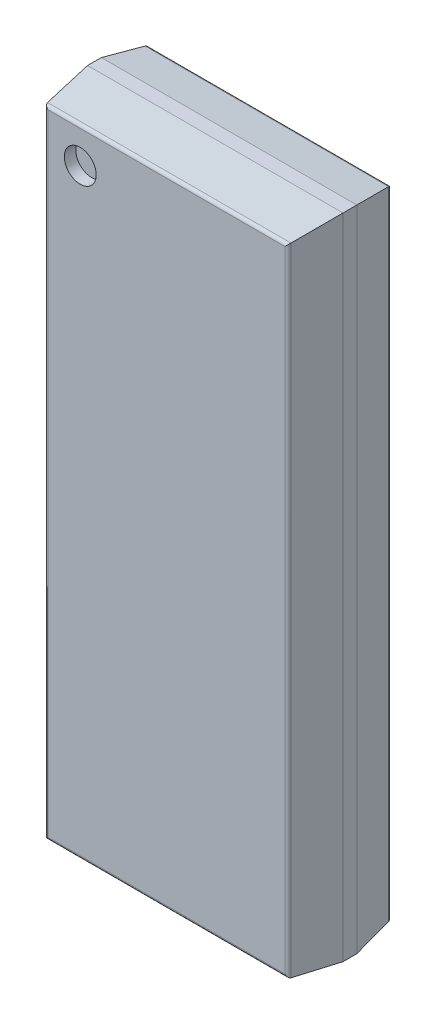
ISO-10303-21;
HEADER;
FILE_DESCRIPTION(('STEP AP214'),'2;1');
FILE_NAME('part.step','',(''),(''),'','','');
FILE_SCHEMA(('AUTOMOTIVE_DESIGN { 1 0 10303 214 1 1 1 1 }'));
ENDSEC;
DATA;
#1=APPLICATION_CONTEXT('core data for automotive mechanical design processes');
#2=APPLICATION_PROTOCOL_DEFINITION('international standard','automotive_design',2000,#1);
#3=PRODUCT_CONTEXT('',#1,'mechanical');
#4=PRODUCT('Part','Part','',(#3));
#5=PRODUCT_RELATED_PRODUCT_CATEGORY('part','',(#4));
#6=PRODUCT_DEFINITION_FORMATION('','',#4);
#7=PRODUCT_DEFINITION_CONTEXT('part definition',#1,'design');
#8=PRODUCT_DEFINITION('design','',#6,#7);
#9=PRODUCT_DEFINITION_SHAPE('','',#8);
#10=(LENGTH_UNIT() NAMED_UNIT(*) SI_UNIT(.MILLI.,.METRE.));
#11=(NAMED_UNIT(*) PLANE_ANGLE_UNIT() SI_UNIT($,.RADIAN.));
#12=(NAMED_UNIT(*) SI_UNIT($,.STERADIAN.) SOLID_ANGLE_UNIT());
#13=UNCERTAINTY_MEASURE_WITH_UNIT(LENGTH_MEASURE(1.E-05),#10,'distance_accuracy_value','');
#14=(GEOMETRIC_REPRESENTATION_CONTEXT(3) GLOBAL_UNCERTAINTY_ASSIGNED_CONTEXT((#13)) GLOBAL_UNIT_ASSIGNED_CONTEXT((#10,
#11,#12)) REPRESENTATION_CONTEXT('',''));
#15=CARTESIAN_POINT('',(0.,0.,0.));
#16=DIRECTION('',(0.,0.,1.));
#17=DIRECTION('',(1.,0.,0.));
#18=AXIS2_PLACEMENT_3D('',#15,#16,#17);
#19=CARTESIAN_POINT('',(-1.315,4.315,1.575));
#20=DIRECTION('',(0.,0.,1.));
#21=DIRECTION('',(1.,0.,0.));
#22=AXIS2_PLACEMENT_3D('',#19,#20,#21);
#23=PLANE('',#22);
#24=CARTESIAN_POINT('',(-1.315,4.315,1.575));
#25=DIRECTION('',(0.,0.,1.));
#26=DIRECTION('',(1.,0.,0.));
#27=AXIS2_PLACEMENT_3D('',#24,#25,#26);
#28=CIRCLE('',#27,0.24375);
#29=CARTESIAN_POINT('',(-1.07125,4.315,1.575));
#30=VERTEX_POINT('',#29);
#31=EDGE_CURVE('E20',#30,#30,#28,.T.);
#32=ORIENTED_EDGE('',*,*,#31,.T.);
#33=EDGE_LOOP('',(#32));
#34=FACE_BOUND('',#33,.T.);
#35=ADVANCED_FACE('F17',(#34),#23,.T.);
#36=CARTESIAN_POINT('',(-1.315,4.315,1.575));
#37=DIRECTION('',(0.,0.,1.));
#38=DIRECTION('',(1.,0.,0.));
#39=AXIS2_PLACEMENT_3D('',#36,#37,#38);
#40=CYLINDRICAL_SURFACE('',#39,0.24375);
#41=CARTESIAN_POINT('',(-1.315,4.315,1.75));
#42=DIRECTION('',(0.,0.,1.));
#43=DIRECTION('',(1.,0.,0.));
#44=AXIS2_PLACEMENT_3D('',#41,#42,#43);
#45=CIRCLE('',#44,0.24375);
#46=CARTESIAN_POINT('',(-1.07125,4.315,1.75));
#47=VERTEX_POINT('',#46);
#48=EDGE_CURVE('E100',#47,#47,#45,.F.);
#49=ORIENTED_EDGE('',*,*,#48,.F.);
#50=EDGE_LOOP('',(#49));
#51=FACE_BOUND('',#50,.T.);
#52=ORIENTED_EDGE('',*,*,#31,.F.);
#53=EDGE_LOOP('',(#52));
#54=FACE_BOUND('',#53,.T.);
#55=ADVANCED_FACE('F117',(#51,#54),#40,.F.);
#56=CARTESIAN_POINT('',(-1.95,-4.95,1.75));
#57=DIRECTION('',(0.,0.,1.));
#58=DIRECTION('',(1.,0.,0.));
#59=AXIS2_PLACEMENT_3D('',#56,#57,#58);
#60=PLANE('',#59);
#61=ORIENTED_EDGE('',*,*,#48,.T.);
#62=EDGE_LOOP('',(#61));
#63=FACE_BOUND('',#62,.T.);
#64=DIRECTION('',(0.,1.,0.));
#65=VECTOR('',#64,1.);
#66=CARTESIAN_POINT('',(1.808604047182,-4.8525,1.75));
#67=LINE('',#66,#65);
#68=CARTESIAN_POINT('',(1.808604047182,4.808604047182,1.75));
#69=VERTEX_POINT('',#68);
#70=CARTESIAN_POINT('',(1.808604047182,-4.808604047182,1.75));
#71=VERTEX_POINT('',#70);
#72=EDGE_CURVE('E107',#69,#71,#67,.F.);
#73=ORIENTED_EDGE('',*,*,#72,.F.);
#74=DIRECTION('',(1.,0.,0.));
#75=VECTOR('',#74,1.);
#76=CARTESIAN_POINT('',(-1.8525,4.808604047182,1.75));
#77=LINE('',#76,#75);
#78=CARTESIAN_POINT('',(-1.808604047182,4.808604047182,1.75));
#79=VERTEX_POINT('',#78);
#80=EDGE_CURVE('E96',#79,#69,#77,.T.);
#81=ORIENTED_EDGE('',*,*,#80,.F.);
#82=DIRECTION('',(0.,1.,0.));
#83=VECTOR('',#82,1.);
#84=CARTESIAN_POINT('',(-1.808604047182,-4.8525,1.75));
#85=LINE('',#84,#83);
#86=CARTESIAN_POINT('',(-1.808604047182,-4.808604047182,1.75));
#87=VERTEX_POINT('',#86);
#88=EDGE_CURVE('E92',#87,#79,#85,.T.);
#89=ORIENTED_EDGE('',*,*,#88,.F.);
#90=DIRECTION('',(1.,0.,0.));
#91=VECTOR('',#90,1.);
#92=CARTESIAN_POINT('',(-1.8525,-4.808604047182,1.75));
#93=LINE('',#92,#91);
#94=EDGE_CURVE('E81',#71,#87,#93,.F.);
#95=ORIENTED_EDGE('',*,*,#94,.F.);
#96=EDGE_LOOP('',(#73,#81,#89,#95));
#97=FACE_BOUND('',#96,.T.);
#98=ADVANCED_FACE('F95',(#63,#97),#60,.T.);
#99=CARTESIAN_POINT('',(-1.808604047182,-4.8525,1.7));
#100=DIRECTION('',(0.,1.,0.));
#101=DIRECTION('',(0.,0.,1.));
#102=AXIS2_PLACEMENT_3D('',#99,#100,#101);
#103=CYLINDRICAL_SURFACE('',#102,0.05);
#104=CARTESIAN_POINT('',(-1.808604047182,4.808604047182,1.7));
#105=DIRECTION('',(0.707106781186547,0.707106781186547,0.));
#106=DIRECTION('',(0.707106781186547,-0.707106781186547,0.));
#107=AXIS2_PLACEMENT_3D('',#104,#105,#106);
#108=ELLIPSE('',#107,0.0707106781186548,0.05);
#109=CARTESIAN_POINT('',(-1.8581832134893,4.8581832134893,1.70647350510086));
#110=VERTEX_POINT('',#109);
#111=EDGE_CURVE('E363',#110,#79,#108,.T.);
#112=ORIENTED_EDGE('',*,*,#111,.F.);
#113=DIRECTION('',(0.,1.,0.));
#114=VECTOR('',#113,1.);
#115=CARTESIAN_POINT('',(-1.85818321348946,-4.95,1.70647350510106));
#116=LINE('',#115,#114);
#117=CARTESIAN_POINT('',(-1.8581832134893,-4.8581832134893,1.70647350510086));
#118=VERTEX_POINT('',#117);
#119=EDGE_CURVE('E104',#110,#118,#116,.F.);
#120=ORIENTED_EDGE('',*,*,#119,.T.);
#121=CARTESIAN_POINT('',(-1.808604047182,-4.808604047182,1.7));
#122=DIRECTION('',(0.707106781186547,-0.707106781186547,0.));
#123=DIRECTION('',(0.707106781186547,0.707106781186547,0.));
#124=AXIS2_PLACEMENT_3D('',#121,#122,#123);
#125=ELLIPSE('',#124,0.0707106781186548,0.05);
#126=EDGE_CURVE('E86',#87,#118,#125,.T.);
#127=ORIENTED_EDGE('',*,*,#126,.F.);
#128=ORIENTED_EDGE('',*,*,#88,.T.);
#129=EDGE_LOOP('',(#112,#120,#127,#128));
#130=FACE_BOUND('',#129,.T.);
#131=ADVANCED_FACE('F103',(#130),#103,.T.);
#132=CARTESIAN_POINT('',(-1.8525,-4.808604047182,1.7));
#133=DIRECTION('',(1.,0.,0.));
#134=DIRECTION('',(0.,0.,-1.));
#135=AXIS2_PLACEMENT_3D('',#132,#133,#134);
#136=CYLINDRICAL_SURFACE('',#135,0.05);
#137=ORIENTED_EDGE('',*,*,#94,.T.);
#138=ORIENTED_EDGE('',*,*,#126,.T.);
#139=DIRECTION('',(1.,0.,0.));
#140=VECTOR('',#139,1.);
#141=CARTESIAN_POINT('',(-1.95,-4.85818321348946,1.70647350510106));
#142=LINE('',#141,#140);
#143=CARTESIAN_POINT('',(1.8581832134893,-4.8581832134893,1.70647350510086));
#144=VERTEX_POINT('',#143);
#145=EDGE_CURVE('E380',#118,#144,#142,.T.);
#146=ORIENTED_EDGE('',*,*,#145,.T.);
#147=CARTESIAN_POINT('',(1.808604047182,-4.808604047182,1.7));
#148=DIRECTION('',(0.707106781186547,0.707106781186547,0.));
#149=DIRECTION('',(-0.707106781186547,0.707106781186547,0.));
#150=AXIS2_PLACEMENT_3D('',#147,#148,#149);
#151=ELLIPSE('',#150,0.0707106781186548,0.05);
#152=EDGE_CURVE('E88',#71,#144,#151,.T.);
#153=ORIENTED_EDGE('',*,*,#152,.F.);
#154=EDGE_LOOP('',(#137,#138,#146,#153));
#155=FACE_BOUND('',#154,.T.);
#156=ADVANCED_FACE('F83',(#155),#136,.T.);
#157=CARTESIAN_POINT('',(1.808604047182,-4.8525,1.7));
#158=DIRECTION('',(0.,1.,0.));
#159=DIRECTION('',(0.,0.,1.));
#160=AXIS2_PLACEMENT_3D('',#157,#158,#159);
#161=CYLINDRICAL_SURFACE('',#160,0.05);
#162=CARTESIAN_POINT('',(1.808604047182,4.808604047182,1.7));
#163=DIRECTION('',(0.707106781186547,-0.707106781186547,0.));
#164=DIRECTION('',(0.707106781186547,0.707106781186547,0.));
#165=AXIS2_PLACEMENT_3D('',#162,#163,#164);
#166=ELLIPSE('',#165,0.0707106781186548,0.05);
#167=CARTESIAN_POINT('',(1.8581832134893,4.8581832134893,1.70647350510086));
#168=VERTEX_POINT('',#167);
#169=EDGE_CURVE('E357',#69,#168,#166,.F.);
#170=ORIENTED_EDGE('',*,*,#169,.F.);
#171=ORIENTED_EDGE('',*,*,#72,.T.);
#172=ORIENTED_EDGE('',*,*,#152,.T.);
#173=DIRECTION('',(0.,1.,0.));
#174=VECTOR('',#173,1.);
#175=CARTESIAN_POINT('',(1.85818321348946,-4.95,1.70647350510106));
#176=LINE('',#175,#174);
#177=EDGE_CURVE('E359',#168,#144,#176,.F.);
#178=ORIENTED_EDGE('',*,*,#177,.F.);
#179=EDGE_LOOP('',(#170,#171,#172,#178));
#180=FACE_BOUND('',#179,.T.);
#181=ADVANCED_FACE('F200',(#180),#161,.T.);
#182=CARTESIAN_POINT('',(-1.8525,4.808604047182,1.7));
#183=DIRECTION('',(1.,0.,0.));
#184=DIRECTION('',(0.,0.,-1.));
#185=AXIS2_PLACEMENT_3D('',#182,#183,#184);
#186=CYLINDRICAL_SURFACE('',#185,0.05);
#187=DIRECTION('',(1.,0.,0.));
#188=VECTOR('',#187,1.);
#189=CARTESIAN_POINT('',(-1.95,4.85818321348946,1.70647350510106));
#190=LINE('',#189,#188);
#191=EDGE_CURVE('E385',#110,#168,#190,.T.);
#192=ORIENTED_EDGE('',*,*,#191,.F.);
#193=ORIENTED_EDGE('',*,*,#111,.T.);
#194=ORIENTED_EDGE('',*,*,#80,.T.);
#195=ORIENTED_EDGE('',*,*,#169,.T.);
#196=EDGE_LOOP('',(#192,#193,#194,#195));
#197=FACE_BOUND('',#196,.T.);
#198=ADVANCED_FACE('F196',(#197),#186,.T.);
#199=CARTESIAN_POINT('',(-1.90125,-4.95,1.376634362701));
#200=DIRECTION('',(0.991583326142965,0.,-0.129470102012995));
#201=DIRECTION('',(-0.129470102012995,0.,-0.991583326142965));
#202=AXIS2_PLACEMENT_3D('',#199,#200,#201);
#203=PLANE('',#202);
#204=DIRECTION('',(0.128398434460269,-0.128398434459505,0.983375657648948));
#205=VECTOR('',#204,1.);
#206=CARTESIAN_POINT('',(-1.95,4.94999999999991,1.00326872540099));
#207=LINE('',#206,#205);
#208=CARTESIAN_POINT('',(-1.95,4.94999999999998,1.003268725401));
#209=VERTEX_POINT('',#208);
#210=EDGE_CURVE('E408',#209,#110,#207,.T.);
#211=ORIENTED_EDGE('',*,*,#210,.F.);
#212=DIRECTION('',(0.,1.,0.));
#213=VECTOR('',#212,1.);
#214=CARTESIAN_POINT('',(-1.95,-4.95,1.003268725401));
#215=LINE('',#214,#213);
#216=CARTESIAN_POINT('',(-1.95,-4.94999999999998,1.003268725401));
#217=VERTEX_POINT('',#216);
#218=EDGE_CURVE('E426',#209,#217,#215,.F.);
#219=ORIENTED_EDGE('',*,*,#218,.T.);
#220=DIRECTION('',(0.128398434460269,0.128398434459505,0.983375657648948));
#221=VECTOR('',#220,1.);
#222=CARTESIAN_POINT('',(-1.95,-4.94999999999991,1.00326872540099));
#223=LINE('',#222,#221);
#224=EDGE_CURVE('E382',#217,#118,#223,.T.);
#225=ORIENTED_EDGE('',*,*,#224,.T.);
#226=ORIENTED_EDGE('',*,*,#119,.F.);
#227=EDGE_LOOP('',(#211,#219,#225,#226));
#228=FACE_BOUND('',#227,.T.);
#229=ADVANCED_FACE('F192',(#228),#203,.F.);
#230=CARTESIAN_POINT('',(-1.95,-4.90125,1.376634362701));
#231=DIRECTION('',(0.,0.991583326142965,-0.129470102012995));
#232=DIRECTION('',(0.,0.129470102012995,0.991583326142965));
#233=AXIS2_PLACEMENT_3D('',#230,#231,#232);
#234=PLANE('',#233);
#235=DIRECTION('',(1.,0.,0.));
#236=VECTOR('',#235,1.);
#237=CARTESIAN_POINT('',(-1.95,-4.95,1.003268725401));
#238=LINE('',#237,#236);
#239=CARTESIAN_POINT('',(1.94999999999998,-4.95,1.003268725401));
#240=VERTEX_POINT('',#239);
#241=EDGE_CURVE('E395',#217,#240,#238,.T.);
#242=ORIENTED_EDGE('',*,*,#241,.T.);
#243=DIRECTION('',(0.128398434459505,-0.128398434460269,-0.983375657648948));
#244=VECTOR('',#243,1.);
#245=CARTESIAN_POINT('',(1.85818321348946,-4.858183213489,1.70647350510106));
#246=LINE('',#245,#244);
#247=EDGE_CURVE('E386',#144,#240,#246,.T.);
#248=ORIENTED_EDGE('',*,*,#247,.F.);
#249=ORIENTED_EDGE('',*,*,#145,.F.);
#250=ORIENTED_EDGE('',*,*,#224,.F.);
#251=EDGE_LOOP('',(#242,#248,#249,#250));
#252=FACE_BOUND('',#251,.T.);
#253=ADVANCED_FACE('F188',(#252),#234,.F.);
#254=CARTESIAN_POINT('',(1.90125,-4.95,1.376634362701));
#255=DIRECTION('',(0.991583326142965,0.,0.129470102012995));
#256=DIRECTION('',(0.129470102012995,0.,-0.991583326142965));
#257=AXIS2_PLACEMENT_3D('',#254,#255,#256);
#258=PLANE('',#257);
#259=DIRECTION('',(0.128398434460269,0.128398434459505,-0.983375657648948));
#260=VECTOR('',#259,1.);
#261=CARTESIAN_POINT('',(1.858183213489,4.85818321348946,1.70647350510106));
#262=LINE('',#261,#260);
#263=CARTESIAN_POINT('',(1.95,4.94999999999998,1.003268725401));
#264=VERTEX_POINT('',#263);
#265=EDGE_CURVE('E388',#168,#264,#262,.T.);
#266=ORIENTED_EDGE('',*,*,#265,.F.);
#267=ORIENTED_EDGE('',*,*,#177,.T.);
#268=ORIENTED_EDGE('',*,*,#247,.T.);
#269=DIRECTION('',(0.,1.,0.));
#270=VECTOR('',#269,1.);
#271=CARTESIAN_POINT('',(1.95,-4.95,1.003268725401));
#272=LINE('',#271,#270);
#273=EDGE_CURVE('E411',#264,#240,#272,.F.);
#274=ORIENTED_EDGE('',*,*,#273,.F.);
#275=EDGE_LOOP('',(#266,#267,#268,#274));
#276=FACE_BOUND('',#275,.T.);
#277=ADVANCED_FACE('F184',(#276),#258,.T.);
#278=CARTESIAN_POINT('',(-1.95,4.90125,1.376634362701));
#279=DIRECTION('',(0.,0.991583326142965,0.129470102012995));
#280=DIRECTION('',(0.,-0.129470102012995,0.991583326142965));
#281=AXIS2_PLACEMENT_3D('',#278,#279,#280);
#282=PLANE('',#281);
#283=DIRECTION('',(1.,0.,0.));
#284=VECTOR('',#283,1.);
#285=CARTESIAN_POINT('',(-1.95,4.95,1.003268725401));
#286=LINE('',#285,#284);
#287=EDGE_CURVE('E417',#209,#264,#286,.T.);
#288=ORIENTED_EDGE('',*,*,#287,.F.);
#289=ORIENTED_EDGE('',*,*,#210,.T.);
#290=ORIENTED_EDGE('',*,*,#191,.T.);
#291=ORIENTED_EDGE('',*,*,#265,.T.);
#292=EDGE_LOOP('',(#288,#289,#290,#291));
#293=FACE_BOUND('',#292,.T.);
#294=ADVANCED_FACE('F180',(#293),#282,.T.);
#295=CARTESIAN_POINT('',(-1.95,-4.95,0.175));
#296=DIRECTION('',(1.,0.,0.));
#297=DIRECTION('',(0.,0.,-1.));
#298=AXIS2_PLACEMENT_3D('',#295,#296,#297);
#299=PLANE('',#298);
#300=DIRECTION('',(0.,0.,1.));
#301=VECTOR('',#300,1.);
#302=CARTESIAN_POINT('',(-1.95,4.95,0.175));
#303=LINE('',#302,#301);
#304=CARTESIAN_POINT('',(-1.94999999999998,4.94999999999994,0.793268725401009));
#305=VERTEX_POINT('',#304);
#306=EDGE_CURVE('E421',#305,#209,#303,.T.);
#307=ORIENTED_EDGE('',*,*,#306,.F.);
#308=DIRECTION('',(0.,1.,0.));
#309=VECTOR('',#308,1.);
#310=CARTESIAN_POINT('',(-1.94999999999992,-4.95,0.793268725401013));
#311=LINE('',#310,#309);
#312=CARTESIAN_POINT('',(-1.94999999999998,-4.94999999999996,0.793268725401009));
#313=VERTEX_POINT('',#312);
#314=EDGE_CURVE('E420',#313,#305,#311,.T.);
#315=ORIENTED_EDGE('',*,*,#314,.F.);
#316=DIRECTION('',(0.,0.,1.));
#317=VECTOR('',#316,1.);
#318=CARTESIAN_POINT('',(-1.95,-4.95,0.175));
#319=LINE('',#318,#317);
#320=EDGE_CURVE('E399',#313,#217,#319,.T.);
#321=ORIENTED_EDGE('',*,*,#320,.T.);
#322=ORIENTED_EDGE('',*,*,#218,.F.);
#323=EDGE_LOOP('',(#307,#315,#321,#322));
#324=FACE_BOUND('',#323,.T.);
#325=ADVANCED_FACE('F176',(#324),#299,.F.);
#326=CARTESIAN_POINT('',(-1.95,-4.95,0.175));
#327=DIRECTION('',(0.,1.,0.));
#328=DIRECTION('',(0.,0.,1.));
#329=AXIS2_PLACEMENT_3D('',#326,#327,#328);
#330=PLANE('',#329);
#331=ORIENTED_EDGE('',*,*,#320,.F.);
#332=DIRECTION('',(1.,0.,0.));
#333=VECTOR('',#332,1.);
#334=CARTESIAN_POINT('',(-1.95,-4.94999999999992,0.793268725401013));
#335=LINE('',#334,#333);
#336=CARTESIAN_POINT('',(1.94999999999996,-4.94999999999998,0.793268725401013));
#337=VERTEX_POINT('',#336);
#338=EDGE_CURVE('E437',#337,#313,#335,.F.);
#339=ORIENTED_EDGE('',*,*,#338,.F.);
#340=DIRECTION('',(0.,0.,-1.));
#341=VECTOR('',#340,1.);
#342=CARTESIAN_POINT('',(1.95,-4.95,0.175));
#343=LINE('',#342,#341);
#344=EDGE_CURVE('E398',#240,#337,#343,.T.);
#345=ORIENTED_EDGE('',*,*,#344,.F.);
#346=ORIENTED_EDGE('',*,*,#241,.F.);
#347=EDGE_LOOP('',(#331,#339,#345,#346));
#348=FACE_BOUND('',#347,.T.);
#349=ADVANCED_FACE('F172',(#348),#330,.F.);
#350=CARTESIAN_POINT('',(1.95,-4.95,0.175));
#351=DIRECTION('',(1.,0.,0.));
#352=DIRECTION('',(0.,0.,-1.));
#353=AXIS2_PLACEMENT_3D('',#350,#351,#352);
#354=PLANE('',#353);
#355=DIRECTION('',(0.,0.,1.));
#356=VECTOR('',#355,1.);
#357=CARTESIAN_POINT('',(1.95,4.95,0.175));
#358=LINE('',#357,#356);
#359=CARTESIAN_POINT('',(1.94999999999998,4.94999999999996,0.793268725401013));
#360=VERTEX_POINT('',#359);
#361=EDGE_CURVE('E414',#264,#360,#358,.F.);
#362=ORIENTED_EDGE('',*,*,#361,.F.);
#363=ORIENTED_EDGE('',*,*,#273,.T.);
#364=ORIENTED_EDGE('',*,*,#344,.T.);
#365=DIRECTION('',(0.,1.,0.));
#366=VECTOR('',#365,1.);
#367=CARTESIAN_POINT('',(1.94999999999992,-4.95,0.793268725401013));
#368=LINE('',#367,#366);
#369=EDGE_CURVE('E447',#337,#360,#368,.T.);
#370=ORIENTED_EDGE('',*,*,#369,.T.);
#371=EDGE_LOOP('',(#362,#363,#364,#370));
#372=FACE_BOUND('',#371,.T.);
#373=ADVANCED_FACE('F168',(#372),#354,.T.);
#374=CARTESIAN_POINT('',(-1.95,4.95,0.175));
#375=DIRECTION('',(0.,1.,0.));
#376=DIRECTION('',(0.,0.,1.));
#377=AXIS2_PLACEMENT_3D('',#374,#375,#376);
#378=PLANE('',#377);
#379=ORIENTED_EDGE('',*,*,#306,.T.);
#380=ORIENTED_EDGE('',*,*,#287,.T.);
#381=ORIENTED_EDGE('',*,*,#361,.T.);
#382=DIRECTION('',(1.,0.,0.));
#383=VECTOR('',#382,1.);
#384=CARTESIAN_POINT('',(-1.95,4.94999999999992,0.793268725401013));
#385=LINE('',#384,#383);
#386=EDGE_CURVE('E462',#360,#305,#385,.F.);
#387=ORIENTED_EDGE('',*,*,#386,.T.);
#388=EDGE_LOOP('',(#379,#380,#381,#387));
#389=FACE_BOUND('',#388,.T.);
#390=ADVANCED_FACE('F164',(#389),#378,.T.);
#391=CARTESIAN_POINT('',(-1.90125,-4.95,0.484134362701));
#392=DIRECTION('',(-0.9877928217052,0.,-0.155773365463031));
#393=DIRECTION('',(-0.155773365463031,0.,0.9877928217052));
#394=AXIS2_PLACEMENT_3D('',#391,#392,#393);
#395=PLANE('',#394);
#396=DIRECTION('',(0.153917132616416,-0.153917132616053,-0.976022045127257));
#397=VECTOR('',#396,1.);
#398=CARTESIAN_POINT('',(-1.95,4.94999999999992,0.793268725401013));
#399=LINE('',#398,#397);
#400=CARTESIAN_POINT('',(-1.85915666024213,4.85915666024223,0.217211331726904));
#401=VERTEX_POINT('',#400);
#402=EDGE_CURVE('E465',#305,#401,#399,.T.);
#403=ORIENTED_EDGE('',*,*,#402,.T.);
#404=DIRECTION('',(0.,1.,0.));
#405=VECTOR('',#404,1.);
#406=CARTESIAN_POINT('',(-1.85915666024228,-4.8525,0.217211331726956));
#407=LINE('',#406,#405);
#408=CARTESIAN_POINT('',(-1.85915666024213,-4.85915666024223,0.217211331726904));
#409=VERTEX_POINT('',#408);
#410=EDGE_CURVE('E370',#409,#401,#407,.T.);
#411=ORIENTED_EDGE('',*,*,#410,.F.);
#412=DIRECTION('',(0.153917132616416,0.153917132616053,-0.976022045127257));
#413=VECTOR('',#412,1.);
#414=CARTESIAN_POINT('',(-1.95,-4.94999999999992,0.793268725401013));
#415=LINE('',#414,#413);
#416=EDGE_CURVE('E440',#313,#409,#415,.T.);
#417=ORIENTED_EDGE('',*,*,#416,.F.);
#418=ORIENTED_EDGE('',*,*,#314,.T.);
#419=EDGE_LOOP('',(#403,#411,#417,#418));
#420=FACE_BOUND('',#419,.T.);
#421=ADVANCED_FACE('F160',(#420),#395,.T.);
#422=CARTESIAN_POINT('',(-1.95,-4.90125,0.484134362701));
#423=DIRECTION('',(0.,-0.9877928217052,-0.155773365463031));
#424=DIRECTION('',(0.,0.155773365463031,-0.9877928217052));
#425=AXIS2_PLACEMENT_3D('',#422,#423,#424);
#426=PLANE('',#425);
#427=ORIENTED_EDGE('',*,*,#338,.T.);
#428=ORIENTED_EDGE('',*,*,#416,.T.);
#429=DIRECTION('',(1.,0.,0.));
#430=VECTOR('',#429,1.);
#431=CARTESIAN_POINT('',(-1.8525,-4.85915666024228,0.217211331726956));
#432=LINE('',#431,#430);
#433=CARTESIAN_POINT('',(1.85915666024223,-4.85915666024213,0.217211331726903));
#434=VERTEX_POINT('',#433);
#435=EDGE_CURVE('E369',#434,#409,#432,.F.);
#436=ORIENTED_EDGE('',*,*,#435,.F.);
#437=DIRECTION('',(0.153917132616052,-0.153917132616416,0.976022045127257));
#438=VECTOR('',#437,1.);
#439=CARTESIAN_POINT('',(1.85915666024214,-4.859156660242,0.217211331726979));
#440=LINE('',#439,#438);
#441=EDGE_CURVE('E451',#434,#337,#440,.T.);
#442=ORIENTED_EDGE('',*,*,#441,.T.);
#443=EDGE_LOOP('',(#427,#428,#436,#442));
#444=FACE_BOUND('',#443,.T.);
#445=ADVANCED_FACE('F156',(#444),#426,.T.);
#446=CARTESIAN_POINT('',(1.90125,-4.95,0.484134362701));
#447=DIRECTION('',(-0.9877928217052,0.,0.155773365463031));
#448=DIRECTION('',(0.155773365463031,0.,0.9877928217052));
#449=AXIS2_PLACEMENT_3D('',#446,#447,#448);
#450=PLANE('',#449);
#451=DIRECTION('',(0.153917132616416,0.153917132616053,0.976022045127257));
#452=VECTOR('',#451,1.);
#453=CARTESIAN_POINT('',(1.859156660242,4.85915666024214,0.217211331726979));
#454=LINE('',#453,#452);
#455=CARTESIAN_POINT('',(1.85915666024213,4.85915666024223,0.217211331726904));
#456=VERTEX_POINT('',#455);
#457=EDGE_CURVE('E450',#456,#360,#454,.T.);
#458=ORIENTED_EDGE('',*,*,#457,.T.);
#459=ORIENTED_EDGE('',*,*,#369,.F.);
#460=ORIENTED_EDGE('',*,*,#441,.F.);
#461=DIRECTION('',(0.,1.,0.));
#462=VECTOR('',#461,1.);
#463=CARTESIAN_POINT('',(1.85915666024228,-4.8525,0.217211331726956));
#464=LINE('',#463,#462);
#465=EDGE_CURVE('E374',#456,#434,#464,.F.);
#466=ORIENTED_EDGE('',*,*,#465,.F.);
#467=EDGE_LOOP('',(#458,#459,#460,#466));
#468=FACE_BOUND('',#467,.T.);
#469=ADVANCED_FACE('F152',(#468),#450,.F.);
#470=CARTESIAN_POINT('',(-1.95,4.90125,0.484134362701));
#471=DIRECTION('',(0.,-0.9877928217052,0.155773365463031));
#472=DIRECTION('',(0.,-0.155773365463031,-0.9877928217052));
#473=AXIS2_PLACEMENT_3D('',#470,#471,#472);
#474=PLANE('',#473);
#475=ORIENTED_EDGE('',*,*,#386,.F.);
#476=ORIENTED_EDGE('',*,*,#457,.F.);
#477=DIRECTION('',(1.,0.,0.));
#478=VECTOR('',#477,1.);
#479=CARTESIAN_POINT('',(-1.8525,4.85915666024228,0.217211331726956));
#480=LINE('',#479,#478);
#481=EDGE_CURVE('E377',#401,#456,#480,.T.);
#482=ORIENTED_EDGE('',*,*,#481,.F.);
#483=ORIENTED_EDGE('',*,*,#402,.F.);
#484=EDGE_LOOP('',(#475,#476,#482,#483));
#485=FACE_BOUND('',#484,.T.);
#486=ADVANCED_FACE('F148',(#485),#474,.F.);
#487=CARTESIAN_POINT('',(-1.809767019157,-4.8525,0.225));
#488=DIRECTION('',(0.,1.,0.));
#489=DIRECTION('',(0.,0.,1.));
#490=AXIS2_PLACEMENT_3D('',#487,#488,#489);
#491=CYLINDRICAL_SURFACE('',#490,0.05);
#492=DIRECTION('',(0.,1.,0.));
#493=VECTOR('',#492,1.);
#494=CARTESIAN_POINT('',(-1.809767019157,-4.95,0.175));
#495=LINE('',#494,#493);
#496=CARTESIAN_POINT('',(-1.809767019157,4.809767019157,0.175));
#497=VERTEX_POINT('',#496);
#498=CARTESIAN_POINT('',(-1.809767019157,-4.809767019157,0.175));
#499=VERTEX_POINT('',#498);
#500=EDGE_CURVE('E378',#497,#499,#495,.F.);
#501=ORIENTED_EDGE('',*,*,#500,.T.);
#502=CARTESIAN_POINT('',(-1.809767019157,-4.809767019157,0.225));
#503=DIRECTION('',(0.707106781186547,-0.707106781186547,0.));
#504=DIRECTION('',(0.707106781186547,0.707106781186547,0.));
#505=AXIS2_PLACEMENT_3D('',#502,#503,#504);
#506=ELLIPSE('',#505,0.0707106781186548,0.05);
#507=EDGE_CURVE('E367',#409,#499,#506,.T.);
#508=ORIENTED_EDGE('',*,*,#507,.F.);
#509=ORIENTED_EDGE('',*,*,#410,.T.);
#510=CARTESIAN_POINT('',(-1.809767019157,4.809767019157,0.225));
#511=DIRECTION('',(0.707106781186547,0.707106781186547,0.));
#512=DIRECTION('',(0.707106781186547,-0.707106781186547,0.));
#513=AXIS2_PLACEMENT_3D('',#510,#511,#512);
#514=ELLIPSE('',#513,0.0707106781186548,0.05);
#515=EDGE_CURVE('E373',#497,#401,#514,.T.);
#516=ORIENTED_EDGE('',*,*,#515,.F.);
#517=EDGE_LOOP('',(#501,#508,#509,#516));
#518=FACE_BOUND('',#517,.T.);
#519=ADVANCED_FACE('F144',(#518),#491,.T.);
#520=CARTESIAN_POINT('',(-1.8525,-4.809767019157,0.225));
#521=DIRECTION('',(1.,0.,0.));
#522=DIRECTION('',(0.,0.,-1.));
#523=AXIS2_PLACEMENT_3D('',#520,#521,#522);
#524=CYLINDRICAL_SURFACE('',#523,0.05);
#525=CARTESIAN_POINT('',(1.809767019157,-4.809767019157,0.225));
#526=DIRECTION('',(0.707106781186547,0.707106781186547,0.));
#527=DIRECTION('',(-0.707106781186547,0.707106781186547,0.));
#528=AXIS2_PLACEMENT_3D('',#525,#526,#527);
#529=ELLIPSE('',#528,0.0707106781186548,0.05);
#530=CARTESIAN_POINT('',(1.809767019157,-4.809767019157,0.175));
#531=VERTEX_POINT('',#530);
#532=EDGE_CURVE('E371',#434,#531,#529,.T.);
#533=ORIENTED_EDGE('',*,*,#532,.F.);
#534=ORIENTED_EDGE('',*,*,#435,.T.);
#535=ORIENTED_EDGE('',*,*,#507,.T.);
#536=DIRECTION('',(1.,0.,0.));
#537=VECTOR('',#536,1.);
#538=CARTESIAN_POINT('',(-1.95,-4.809767019157,0.175));
#539=LINE('',#538,#537);
#540=EDGE_CURVE('E488',#499,#531,#539,.T.);
#541=ORIENTED_EDGE('',*,*,#540,.T.);
#542=EDGE_LOOP('',(#533,#534,#535,#541));
#543=FACE_BOUND('',#542,.T.);
#544=ADVANCED_FACE('F140',(#543),#524,.T.);
#545=CARTESIAN_POINT('',(1.809767019157,-4.8525,0.225));
#546=DIRECTION('',(0.,1.,0.));
#547=DIRECTION('',(0.,0.,1.));
#548=AXIS2_PLACEMENT_3D('',#545,#546,#547);
#549=CYLINDRICAL_SURFACE('',#548,0.05);
#550=ORIENTED_EDGE('',*,*,#465,.T.);
#551=ORIENTED_EDGE('',*,*,#532,.T.);
#552=DIRECTION('',(0.,1.,0.));
#553=VECTOR('',#552,1.);
#554=CARTESIAN_POINT('',(1.809767019157,-4.95,0.175));
#555=LINE('',#554,#553);
#556=CARTESIAN_POINT('',(1.809767019157,4.809767019157,0.175));
#557=VERTEX_POINT('',#556);
#558=EDGE_CURVE('E26',#531,#557,#555,.T.);
#559=ORIENTED_EDGE('',*,*,#558,.T.);
#560=CARTESIAN_POINT('',(1.809767019157,4.809767019157,0.225));
#561=DIRECTION('',(0.707106781186547,-0.707106781186547,0.));
#562=DIRECTION('',(0.707106781186547,0.707106781186547,0.));
#563=AXIS2_PLACEMENT_3D('',#560,#561,#562);
#564=ELLIPSE('',#563,0.0707106781186548,0.05);
#565=EDGE_CURVE('E34',#456,#557,#564,.F.);
#566=ORIENTED_EDGE('',*,*,#565,.F.);
#567=EDGE_LOOP('',(#550,#551,#559,#566));
#568=FACE_BOUND('',#567,.T.);
#569=ADVANCED_FACE('F134',(#568),#549,.T.);
#570=CARTESIAN_POINT('',(-1.8525,4.809767019157,0.225));
#571=DIRECTION('',(1.,0.,0.));
#572=DIRECTION('',(0.,0.,-1.));
#573=AXIS2_PLACEMENT_3D('',#570,#571,#572);
#574=CYLINDRICAL_SURFACE('',#573,0.05);
#575=ORIENTED_EDGE('',*,*,#565,.T.);
#576=DIRECTION('',(1.,0.,0.));
#577=VECTOR('',#576,1.);
#578=CARTESIAN_POINT('',(-1.95,4.809767019157,0.175));
#579=LINE('',#578,#577);
#580=EDGE_CURVE('E11',#557,#497,#579,.F.);
#581=ORIENTED_EDGE('',*,*,#580,.T.);
#582=ORIENTED_EDGE('',*,*,#515,.T.);
#583=ORIENTED_EDGE('',*,*,#481,.T.);
#584=EDGE_LOOP('',(#575,#581,#582,#583));
#585=FACE_BOUND('',#584,.T.);
#586=ADVANCED_FACE('F128',(#585),#574,.T.);
#587=CARTESIAN_POINT('',(-1.95,-4.95,0.175));
#588=DIRECTION('',(0.,0.,1.));
#589=DIRECTION('',(1.,0.,0.));
#590=AXIS2_PLACEMENT_3D('',#587,#588,#589);
#591=PLANE('',#590);
#592=ORIENTED_EDGE('',*,*,#558,.F.);
#593=ORIENTED_EDGE('',*,*,#540,.F.);
#594=ORIENTED_EDGE('',*,*,#500,.F.);
#595=ORIENTED_EDGE('',*,*,#580,.F.);
#596=EDGE_LOOP('',(#592,#593,#594,#595));
#597=FACE_BOUND('',#596,.T.);
#598=ADVANCED_FACE('F126',(#597),#591,.F.);
#599=CLOSED_SHELL('',(#35,#55,#98,#131,#156,#181,#198,#229,#253,#277,#294,#325,#349,#373,#390,
#421,#445,#469,#486,#519,#544,#569,#586,#598));
#600=MANIFOLD_SOLID_BREP('B1',#599);
#601=ADVANCED_BREP_SHAPE_REPRESENTATION('',(#18,#600),#14);
#602=SHAPE_DEFINITION_REPRESENTATION(#9,#601);
ENDSEC;
END-ISO-10303-21;
